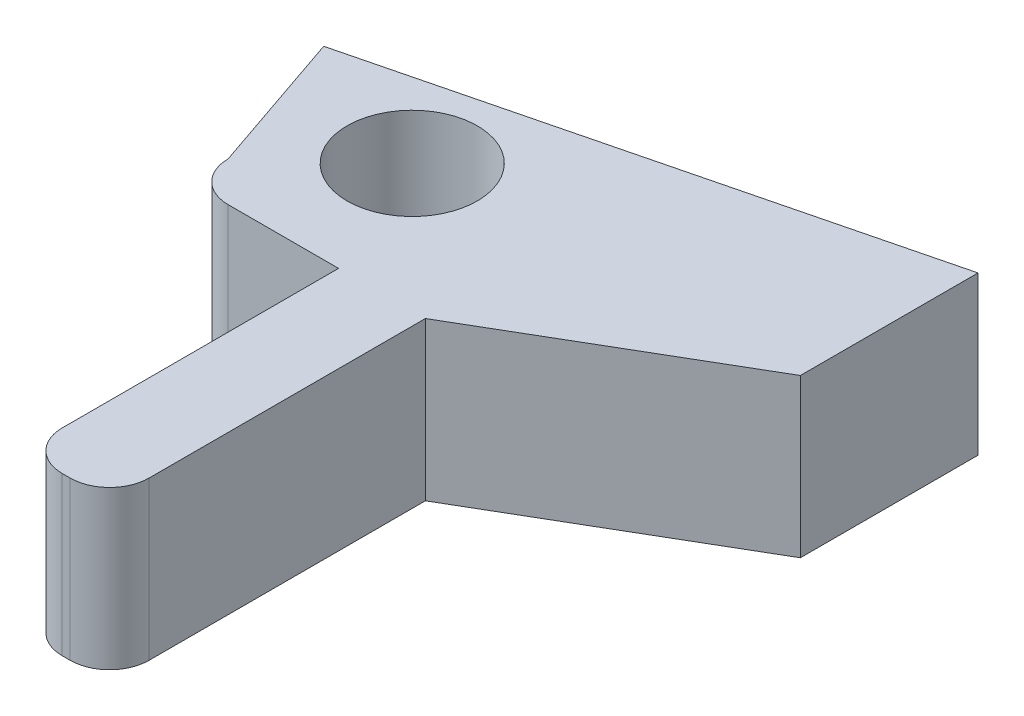
ISO-10303-21;
HEADER;
FILE_DESCRIPTION(('STEP AP214'),'2;1');
FILE_NAME('part.step','',(''),(''),'','','');
FILE_SCHEMA(('AUTOMOTIVE_DESIGN { 1 0 10303 214 1 1 1 1 }'));
ENDSEC;
DATA;
#1=APPLICATION_CONTEXT('core data for automotive mechanical design processes');
#2=APPLICATION_PROTOCOL_DEFINITION('international standard','automotive_design',2000,#1);
#3=PRODUCT_CONTEXT('',#1,'mechanical');
#4=PRODUCT('Part','Part','',(#3));
#5=PRODUCT_RELATED_PRODUCT_CATEGORY('part','',(#4));
#6=PRODUCT_DEFINITION_FORMATION('','',#4);
#7=PRODUCT_DEFINITION_CONTEXT('part definition',#1,'design');
#8=PRODUCT_DEFINITION('design','',#6,#7);
#9=PRODUCT_DEFINITION_SHAPE('','',#8);
#10=(LENGTH_UNIT() NAMED_UNIT(*) SI_UNIT(.MILLI.,.METRE.));
#11=(NAMED_UNIT(*) PLANE_ANGLE_UNIT() SI_UNIT($,.RADIAN.));
#12=(NAMED_UNIT(*) SI_UNIT($,.STERADIAN.) SOLID_ANGLE_UNIT());
#13=UNCERTAINTY_MEASURE_WITH_UNIT(LENGTH_MEASURE(1.E-05),#10,'distance_accuracy_value','');
#14=(GEOMETRIC_REPRESENTATION_CONTEXT(3) GLOBAL_UNCERTAINTY_ASSIGNED_CONTEXT((#13)) GLOBAL_UNIT_ASSIGNED_CONTEXT((#10,
#11,#12)) REPRESENTATION_CONTEXT('',''));
#15=CARTESIAN_POINT('',(0.,0.,0.));
#16=DIRECTION('',(0.,0.,1.));
#17=DIRECTION('',(1.,0.,0.));
#18=AXIS2_PLACEMENT_3D('',#15,#16,#17);
#19=CARTESIAN_POINT('',(0.,4.,0.));
#20=DIRECTION('',(0.,1.,0.));
#21=DIRECTION('',(0.,0.,1.));
#22=AXIS2_PLACEMENT_3D('',#19,#20,#21);
#23=PLANE('',#22);
#24=DIRECTION('',(-0.970142500145332,0.,0.242535625036333));
#25=VECTOR('',#24,1.);
#26=CARTESIAN_POINT('',(4.78197201882964,4.,-3.));
#27=LINE('',#26,#25);
#28=CARTESIAN_POINT('',(4.78197201882964,4.,-3.));
#29=VERTEX_POINT('',#28);
#30=CARTESIAN_POINT('',(-8.47921323135929,4.,0.315296312547233));
#31=VERTEX_POINT('',#30);
#32=EDGE_CURVE('E166',#29,#31,#27,.T.);
#33=ORIENTED_EDGE('',*,*,#32,.T.);
#34=DIRECTION('',(0.323832197654848,0.,0.946114532053087));
#35=VECTOR('',#34,1.);
#36=CARTESIAN_POINT('',(-8.47921323135929,4.,0.315296312547233));
#37=LINE('',#36,#35);
#38=CARTESIAN_POINT('',(-7.21802798117036,4.,4.00000000000001));
#39=VERTEX_POINT('',#38);
#40=EDGE_CURVE('E132',#31,#39,#37,.T.);
#41=ORIENTED_EDGE('',*,*,#40,.T.);
#42=CARTESIAN_POINT('',(-6.21802798117036,4.,4.));
#43=DIRECTION('',(0.,1.,0.));
#44=DIRECTION('',(0.,0.,1.));
#45=AXIS2_PLACEMENT_3D('',#42,#43,#44);
#46=CIRCLE('',#45,1.);
#47=CARTESIAN_POINT('',(-6.21802798117036,4.,5.));
#48=VERTEX_POINT('',#47);
#49=EDGE_CURVE('E11',#39,#48,#46,.T.);
#50=ORIENTED_EDGE('',*,*,#49,.T.);
#51=DIRECTION('',(1.,0.,0.));
#52=VECTOR('',#51,1.);
#53=CARTESIAN_POINT('',(-7.21802798117036,4.,5.));
#54=LINE('',#53,#52);
#55=CARTESIAN_POINT('',(-3.41802798117036,4.,5.));
#56=VERTEX_POINT('',#55);
#57=EDGE_CURVE('E169',#48,#56,#54,.T.);
#58=ORIENTED_EDGE('',*,*,#57,.T.);
#59=DIRECTION('',(0.,0.,1.));
#60=VECTOR('',#59,1.);
#61=CARTESIAN_POINT('',(-3.41802798117036,4.,5.));
#62=LINE('',#61,#60);
#63=CARTESIAN_POINT('',(-3.41802798117036,4.,12.));
#64=VERTEX_POINT('',#63);
#65=EDGE_CURVE('E151',#56,#64,#62,.T.);
#66=ORIENTED_EDGE('',*,*,#65,.T.);
#67=CARTESIAN_POINT('',(-2.41802798117036,4.,12.));
#68=DIRECTION('',(0.,1.,0.));
#69=DIRECTION('',(0.,0.,1.));
#70=AXIS2_PLACEMENT_3D('',#67,#68,#69);
#71=CIRCLE('',#70,1.);
#72=CARTESIAN_POINT('',(-2.41802798117036,4.,13.));
#73=VERTEX_POINT('',#72);
#74=EDGE_CURVE('E190',#64,#73,#71,.T.);
#75=ORIENTED_EDGE('',*,*,#74,.T.);
#76=DIRECTION('',(1.,0.,0.));
#77=VECTOR('',#76,1.);
#78=CARTESIAN_POINT('',(-1.21802798117036,4.,13.));
#79=LINE('',#78,#77);
#80=CARTESIAN_POINT('',(-2.21802798117036,4.,13.));
#81=VERTEX_POINT('',#80);
#82=EDGE_CURVE('E143',#73,#81,#79,.T.);
#83=ORIENTED_EDGE('',*,*,#82,.T.);
#84=CARTESIAN_POINT('',(-2.21802798117036,4.,12.));
#85=DIRECTION('',(0.,1.,0.));
#86=DIRECTION('',(0.,0.,1.));
#87=AXIS2_PLACEMENT_3D('',#84,#85,#86);
#88=CIRCLE('',#87,1.);
#89=CARTESIAN_POINT('',(-1.21802798117036,4.,12.));
#90=VERTEX_POINT('',#89);
#91=EDGE_CURVE('E192',#81,#90,#88,.T.);
#92=ORIENTED_EDGE('',*,*,#91,.T.);
#93=DIRECTION('',(0.,0.,-1.));
#94=VECTOR('',#93,1.);
#95=CARTESIAN_POINT('',(-1.21802798117036,4.,5.));
#96=LINE('',#95,#94);
#97=CARTESIAN_POINT('',(-1.21802798117036,4.,5.));
#98=VERTEX_POINT('',#97);
#99=EDGE_CURVE('E133',#90,#98,#96,.T.);
#100=ORIENTED_EDGE('',*,*,#99,.T.);
#101=DIRECTION('',(0.863778900898433,0.,-0.503871025524086));
#102=VECTOR('',#101,1.);
#103=CARTESIAN_POINT('',(-1.21802798117036,4.,5.));
#104=LINE('',#103,#102);
#105=CARTESIAN_POINT('',(4.78197201882964,4.,1.5));
#106=VERTEX_POINT('',#105);
#107=EDGE_CURVE('E171',#98,#106,#104,.T.);
#108=ORIENTED_EDGE('',*,*,#107,.T.);
#109=DIRECTION('',(0.,0.,-1.));
#110=VECTOR('',#109,1.);
#111=CARTESIAN_POINT('',(4.78197201882964,4.,-3.));
#112=LINE('',#111,#110);
#113=EDGE_CURVE('E163',#106,#29,#112,.T.);
#114=ORIENTED_EDGE('',*,*,#113,.T.);
#115=EDGE_LOOP('',(#33,#41,#50,#58,#66,#75,#83,#92,#100,#108,#114));
#116=FACE_BOUND('',#115,.T.);
#117=CARTESIAN_POINT('',(-4.78871413016682,4.,1.76345727197927));
#118=DIRECTION('',(0.,1.,0.));
#119=DIRECTION('',(0.,0.,1.));
#120=AXIS2_PLACEMENT_3D('',#117,#118,#119);
#121=CIRCLE('',#120,1.65);
#122=CARTESIAN_POINT('',(-4.78871413016682,4.,3.41345727197927));
#123=VERTEX_POINT('',#122);
#124=EDGE_CURVE('E125',#123,#123,#121,.T.);
#125=ORIENTED_EDGE('',*,*,#124,.F.);
#126=EDGE_LOOP('',(#125));
#127=FACE_BOUND('',#126,.T.);
#128=ADVANCED_FACE('F33',(#116,#127),#23,.T.);
#129=CARTESIAN_POINT('',(0.,0.,0.));
#130=DIRECTION('',(0.,1.,0.));
#131=DIRECTION('',(0.,0.,1.));
#132=AXIS2_PLACEMENT_3D('',#129,#130,#131);
#133=PLANE('',#132);
#134=DIRECTION('',(1.,0.,0.));
#135=VECTOR('',#134,1.);
#136=CARTESIAN_POINT('',(-7.21802798117036,0.,5.));
#137=LINE('',#136,#135);
#138=CARTESIAN_POINT('',(-6.21802798117036,0.,5.));
#139=VERTEX_POINT('',#138);
#140=CARTESIAN_POINT('',(-3.41802798117036,0.,5.));
#141=VERTEX_POINT('',#140);
#142=EDGE_CURVE('E124',#139,#141,#137,.T.);
#143=ORIENTED_EDGE('',*,*,#142,.F.);
#144=CARTESIAN_POINT('',(-6.21802798117036,0.,4.));
#145=DIRECTION('',(0.,1.,0.));
#146=DIRECTION('',(0.,0.,1.));
#147=AXIS2_PLACEMENT_3D('',#144,#145,#146);
#148=CIRCLE('',#147,1.);
#149=CARTESIAN_POINT('',(-7.21802798117036,0.,4.));
#150=VERTEX_POINT('',#149);
#151=EDGE_CURVE('E48',#139,#150,#148,.F.);
#152=ORIENTED_EDGE('',*,*,#151,.T.);
#153=DIRECTION('',(0.323832197654848,0.,0.946114532053087));
#154=VECTOR('',#153,1.);
#155=CARTESIAN_POINT('',(-8.47921323135929,0.,0.315296312547233));
#156=LINE('',#155,#154);
#157=CARTESIAN_POINT('',(-8.47921323135929,0.,0.315296312547233));
#158=VERTEX_POINT('',#157);
#159=EDGE_CURVE('E131',#158,#150,#156,.T.);
#160=ORIENTED_EDGE('',*,*,#159,.F.);
#161=DIRECTION('',(-0.970142500145332,0.,0.242535625036333));
#162=VECTOR('',#161,1.);
#163=CARTESIAN_POINT('',(4.78197201882964,0.,-3.));
#164=LINE('',#163,#162);
#165=CARTESIAN_POINT('',(4.78197201882964,0.,-3.));
#166=VERTEX_POINT('',#165);
#167=EDGE_CURVE('E116',#166,#158,#164,.T.);
#168=ORIENTED_EDGE('',*,*,#167,.F.);
#169=DIRECTION('',(0.,0.,-1.));
#170=VECTOR('',#169,1.);
#171=CARTESIAN_POINT('',(4.78197201882964,0.,0.));
#172=LINE('',#171,#170);
#173=CARTESIAN_POINT('',(4.78197201882964,0.,1.5));
#174=VERTEX_POINT('',#173);
#175=EDGE_CURVE('E167',#174,#166,#172,.T.);
#176=ORIENTED_EDGE('',*,*,#175,.F.);
#177=DIRECTION('',(0.863778900898433,0.,-0.503871025524086));
#178=VECTOR('',#177,1.);
#179=CARTESIAN_POINT('',(-1.21802798117036,0.,5.));
#180=LINE('',#179,#178);
#181=CARTESIAN_POINT('',(-1.21802798117036,0.,5.));
#182=VERTEX_POINT('',#181);
#183=EDGE_CURVE('E176',#182,#174,#180,.T.);
#184=ORIENTED_EDGE('',*,*,#183,.F.);
#185=DIRECTION('',(0.,0.,-1.));
#186=VECTOR('',#185,1.);
#187=CARTESIAN_POINT('',(-1.21802798117036,0.,5.));
#188=LINE('',#187,#186);
#189=CARTESIAN_POINT('',(-1.21802798117036,0.,12.));
#190=VERTEX_POINT('',#189);
#191=EDGE_CURVE('E140',#190,#182,#188,.T.);
#192=ORIENTED_EDGE('',*,*,#191,.F.);
#193=CARTESIAN_POINT('',(-2.21802798117036,0.,12.));
#194=DIRECTION('',(0.,1.,0.));
#195=DIRECTION('',(0.,0.,1.));
#196=AXIS2_PLACEMENT_3D('',#193,#194,#195);
#197=CIRCLE('',#196,1.);
#198=CARTESIAN_POINT('',(-2.21802798117036,0.,13.));
#199=VERTEX_POINT('',#198);
#200=EDGE_CURVE('E198',#190,#199,#197,.F.);
#201=ORIENTED_EDGE('',*,*,#200,.T.);
#202=DIRECTION('',(1.,0.,0.));
#203=VECTOR('',#202,1.);
#204=CARTESIAN_POINT('',(-1.21802798117036,0.,13.));
#205=LINE('',#204,#203);
#206=CARTESIAN_POINT('',(-2.41802798117036,0.,13.));
#207=VERTEX_POINT('',#206);
#208=EDGE_CURVE('E146',#207,#199,#205,.T.);
#209=ORIENTED_EDGE('',*,*,#208,.F.);
#210=CARTESIAN_POINT('',(-2.41802798117036,0.,12.));
#211=DIRECTION('',(0.,1.,0.));
#212=DIRECTION('',(0.,0.,1.));
#213=AXIS2_PLACEMENT_3D('',#210,#211,#212);
#214=CIRCLE('',#213,1.);
#215=CARTESIAN_POINT('',(-3.41802798117036,0.,12.));
#216=VERTEX_POINT('',#215);
#217=EDGE_CURVE('E196',#207,#216,#214,.F.);
#218=ORIENTED_EDGE('',*,*,#217,.T.);
#219=DIRECTION('',(0.,0.,1.));
#220=VECTOR('',#219,1.);
#221=CARTESIAN_POINT('',(-3.41802798117036,0.,5.));
#222=LINE('',#221,#220);
#223=EDGE_CURVE('E142',#141,#216,#222,.T.);
#224=ORIENTED_EDGE('',*,*,#223,.F.);
#225=EDGE_LOOP('',(#143,#152,#160,#168,#176,#184,#192,#201,#209,#218,#224));
#226=FACE_BOUND('',#225,.T.);
#227=CARTESIAN_POINT('',(-4.78871413016682,0.,1.76345727197927));
#228=DIRECTION('',(0.,1.,0.));
#229=DIRECTION('',(0.,0.,1.));
#230=AXIS2_PLACEMENT_3D('',#227,#228,#229);
#231=CIRCLE('',#230,1.65);
#232=CARTESIAN_POINT('',(-4.78871413016682,0.,3.41345727197927));
#233=VERTEX_POINT('',#232);
#234=EDGE_CURVE('E158',#233,#233,#231,.T.);
#235=ORIENTED_EDGE('',*,*,#234,.T.);
#236=EDGE_LOOP('',(#235));
#237=FACE_BOUND('',#236,.T.);
#238=ADVANCED_FACE('F135',(#226,#237),#133,.F.);
#239=CARTESIAN_POINT('',(4.78197201882964,4.,-3.));
#240=DIRECTION('',(0.242535625036333,0.,0.970142500145332));
#241=DIRECTION('',(0.970142500145332,0.,-0.242535625036333));
#242=AXIS2_PLACEMENT_3D('',#239,#240,#241);
#243=PLANE('',#242);
#244=ORIENTED_EDGE('',*,*,#167,.T.);
#245=DIRECTION('',(0.,1.,0.));
#246=VECTOR('',#245,1.);
#247=CARTESIAN_POINT('',(-8.47921323135929,0.,0.315296312547233));
#248=LINE('',#247,#246);
#249=EDGE_CURVE('E119',#158,#31,#248,.T.);
#250=ORIENTED_EDGE('',*,*,#249,.T.);
#251=ORIENTED_EDGE('',*,*,#32,.F.);
#252=DIRECTION('',(0.,-1.,0.));
#253=VECTOR('',#252,1.);
#254=CARTESIAN_POINT('',(4.78197201882964,4.,-3.));
#255=LINE('',#254,#253);
#256=EDGE_CURVE('E122',#29,#166,#255,.T.);
#257=ORIENTED_EDGE('',*,*,#256,.T.);
#258=EDGE_LOOP('',(#244,#250,#251,#257));
#259=FACE_BOUND('',#258,.T.);
#260=ADVANCED_FACE('F118',(#259),#243,.F.);
#261=CARTESIAN_POINT('',(-7.21802798117036,4.,5.));
#262=DIRECTION('',(0.,0.,-1.));
#263=DIRECTION('',(-1.,0.,0.));
#264=AXIS2_PLACEMENT_3D('',#261,#262,#263);
#265=PLANE('',#264);
#266=ORIENTED_EDGE('',*,*,#57,.F.);
#267=DIRECTION('',(0.,-1.,0.));
#268=VECTOR('',#267,1.);
#269=CARTESIAN_POINT('',(-6.21802798117036,4.,5.));
#270=LINE('',#269,#268);
#271=EDGE_CURVE('E203',#48,#139,#270,.T.);
#272=ORIENTED_EDGE('',*,*,#271,.T.);
#273=ORIENTED_EDGE('',*,*,#142,.T.);
#274=DIRECTION('',(0.,1.,0.));
#275=VECTOR('',#274,1.);
#276=CARTESIAN_POINT('',(-3.41802798117036,0.,5.));
#277=LINE('',#276,#275);
#278=EDGE_CURVE('E149',#141,#56,#277,.T.);
#279=ORIENTED_EDGE('',*,*,#278,.T.);
#280=EDGE_LOOP('',(#266,#272,#273,#279));
#281=FACE_BOUND('',#280,.T.);
#282=ADVANCED_FACE('F240',(#281),#265,.F.);
#283=CARTESIAN_POINT('',(-1.21802798117036,4.,5.));
#284=DIRECTION('',(-0.503871025524086,0.,-0.863778900898433));
#285=DIRECTION('',(-0.863778900898433,0.,0.503871025524086));
#286=AXIS2_PLACEMENT_3D('',#283,#284,#285);
#287=PLANE('',#286);
#288=ORIENTED_EDGE('',*,*,#183,.T.);
#289=DIRECTION('',(0.,-1.,0.));
#290=VECTOR('',#289,1.);
#291=CARTESIAN_POINT('',(4.78197201882964,4.,1.5));
#292=LINE('',#291,#290);
#293=EDGE_CURVE('E173',#106,#174,#292,.T.);
#294=ORIENTED_EDGE('',*,*,#293,.F.);
#295=ORIENTED_EDGE('',*,*,#107,.F.);
#296=DIRECTION('',(0.,-1.,0.));
#297=VECTOR('',#296,1.);
#298=CARTESIAN_POINT('',(-1.21802798117036,4.,5.));
#299=LINE('',#298,#297);
#300=EDGE_CURVE('E181',#98,#182,#299,.T.);
#301=ORIENTED_EDGE('',*,*,#300,.T.);
#302=EDGE_LOOP('',(#288,#294,#295,#301));
#303=FACE_BOUND('',#302,.T.);
#304=ADVANCED_FACE('F216',(#303),#287,.F.);
#305=CARTESIAN_POINT('',(4.78197201882964,4.,0.));
#306=DIRECTION('',(-1.,0.,0.));
#307=DIRECTION('',(0.,0.,1.));
#308=AXIS2_PLACEMENT_3D('',#305,#306,#307);
#309=PLANE('',#308);
#310=ORIENTED_EDGE('',*,*,#175,.T.);
#311=ORIENTED_EDGE('',*,*,#256,.F.);
#312=ORIENTED_EDGE('',*,*,#113,.F.);
#313=ORIENTED_EDGE('',*,*,#293,.T.);
#314=EDGE_LOOP('',(#310,#311,#312,#313));
#315=FACE_BOUND('',#314,.T.);
#316=ADVANCED_FACE('F211',(#315),#309,.F.);
#317=CARTESIAN_POINT('',(-4.78871413016682,4.,1.76345727197927));
#318=DIRECTION('',(0.,-1.,0.));
#319=DIRECTION('',(0.,0.,-1.));
#320=AXIS2_PLACEMENT_3D('',#317,#318,#319);
#321=CYLINDRICAL_SURFACE('',#320,1.65);
#322=ORIENTED_EDGE('',*,*,#124,.T.);
#323=EDGE_LOOP('',(#322));
#324=FACE_BOUND('',#323,.T.);
#325=ORIENTED_EDGE('',*,*,#234,.F.);
#326=EDGE_LOOP('',(#325));
#327=FACE_BOUND('',#326,.T.);
#328=ADVANCED_FACE('F257',(#324,#327),#321,.F.);
#329=CARTESIAN_POINT('',(-1.21802798117036,0.,5.));
#330=DIRECTION('',(1.,0.,0.));
#331=DIRECTION('',(0.,0.,-1.));
#332=AXIS2_PLACEMENT_3D('',#329,#330,#331);
#333=PLANE('',#332);
#334=ORIENTED_EDGE('',*,*,#99,.F.);
#335=DIRECTION('',(0.,1.,0.));
#336=VECTOR('',#335,1.);
#337=CARTESIAN_POINT('',(-1.21802798117036,0.,12.));
#338=LINE('',#337,#336);
#339=EDGE_CURVE('E194',#90,#190,#338,.F.);
#340=ORIENTED_EDGE('',*,*,#339,.T.);
#341=ORIENTED_EDGE('',*,*,#191,.T.);
#342=ORIENTED_EDGE('',*,*,#300,.F.);
#343=EDGE_LOOP('',(#334,#340,#341,#342));
#344=FACE_BOUND('',#343,.T.);
#345=ADVANCED_FACE('F220',(#344),#333,.T.);
#346=CARTESIAN_POINT('',(-1.21802798117036,0.,13.));
#347=DIRECTION('',(0.,0.,1.));
#348=DIRECTION('',(1.,0.,0.));
#349=AXIS2_PLACEMENT_3D('',#346,#347,#348);
#350=PLANE('',#349);
#351=ORIENTED_EDGE('',*,*,#208,.T.);
#352=DIRECTION('',(0.,1.,0.));
#353=VECTOR('',#352,1.);
#354=CARTESIAN_POINT('',(-2.21802798117036,0.,13.));
#355=LINE('',#354,#353);
#356=EDGE_CURVE('E187',#199,#81,#355,.T.);
#357=ORIENTED_EDGE('',*,*,#356,.T.);
#358=ORIENTED_EDGE('',*,*,#82,.F.);
#359=DIRECTION('',(0.,1.,0.));
#360=VECTOR('',#359,1.);
#361=CARTESIAN_POINT('',(-2.41802798117036,0.,13.));
#362=LINE('',#361,#360);
#363=EDGE_CURVE('E185',#73,#207,#362,.F.);
#364=ORIENTED_EDGE('',*,*,#363,.T.);
#365=EDGE_LOOP('',(#351,#357,#358,#364));
#366=FACE_BOUND('',#365,.T.);
#367=ADVANCED_FACE('F228',(#366),#350,.T.);
#368=CARTESIAN_POINT('',(-3.41802798117036,0.,5.));
#369=DIRECTION('',(-1.,0.,0.));
#370=DIRECTION('',(0.,0.,1.));
#371=AXIS2_PLACEMENT_3D('',#368,#369,#370);
#372=PLANE('',#371);
#373=ORIENTED_EDGE('',*,*,#223,.T.);
#374=DIRECTION('',(0.,1.,0.));
#375=VECTOR('',#374,1.);
#376=CARTESIAN_POINT('',(-3.41802798117036,0.,12.));
#377=LINE('',#376,#375);
#378=EDGE_CURVE('E200',#216,#64,#377,.T.);
#379=ORIENTED_EDGE('',*,*,#378,.T.);
#380=ORIENTED_EDGE('',*,*,#65,.F.);
#381=ORIENTED_EDGE('',*,*,#278,.F.);
#382=EDGE_LOOP('',(#373,#379,#380,#381));
#383=FACE_BOUND('',#382,.T.);
#384=ADVANCED_FACE('F237',(#383),#372,.T.);
#385=CARTESIAN_POINT('',(-2.21802798117036,0.,12.));
#386=DIRECTION('',(0.,1.,0.));
#387=DIRECTION('',(0.,0.,1.));
#388=AXIS2_PLACEMENT_3D('',#385,#386,#387);
#389=CYLINDRICAL_SURFACE('',#388,1.);
#390=ORIENTED_EDGE('',*,*,#200,.F.);
#391=ORIENTED_EDGE('',*,*,#339,.F.);
#392=ORIENTED_EDGE('',*,*,#91,.F.);
#393=ORIENTED_EDGE('',*,*,#356,.F.);
#394=EDGE_LOOP('',(#390,#391,#392,#393));
#395=FACE_BOUND('',#394,.T.);
#396=ADVANCED_FACE('F223',(#395),#389,.T.);
#397=CARTESIAN_POINT('',(-2.41802798117036,0.,12.));
#398=DIRECTION('',(0.,1.,0.));
#399=DIRECTION('',(0.,0.,1.));
#400=AXIS2_PLACEMENT_3D('',#397,#398,#399);
#401=CYLINDRICAL_SURFACE('',#400,1.);
#402=ORIENTED_EDGE('',*,*,#217,.F.);
#403=ORIENTED_EDGE('',*,*,#363,.F.);
#404=ORIENTED_EDGE('',*,*,#74,.F.);
#405=ORIENTED_EDGE('',*,*,#378,.F.);
#406=EDGE_LOOP('',(#402,#403,#404,#405));
#407=FACE_BOUND('',#406,.T.);
#408=ADVANCED_FACE('F232',(#407),#401,.T.);
#409=CARTESIAN_POINT('',(-6.21802798117036,4.,4.));
#410=DIRECTION('',(0.,-1.,0.));
#411=DIRECTION('',(0.,0.,-1.));
#412=AXIS2_PLACEMENT_3D('',#409,#410,#411);
#413=CYLINDRICAL_SURFACE('',#412,1.);
#414=ORIENTED_EDGE('',*,*,#49,.F.);
#415=DIRECTION('',(0.,-1.,0.));
#416=VECTOR('',#415,1.);
#417=CARTESIAN_POINT('',(-7.21802798117036,4.,4.));
#418=LINE('',#417,#416);
#419=EDGE_CURVE('E41',#150,#39,#418,.F.);
#420=ORIENTED_EDGE('',*,*,#419,.F.);
#421=ORIENTED_EDGE('',*,*,#151,.F.);
#422=ORIENTED_EDGE('',*,*,#271,.F.);
#423=EDGE_LOOP('',(#414,#420,#421,#422));
#424=FACE_BOUND('',#423,.T.);
#425=ADVANCED_FACE('F35',(#424),#413,.T.);
#426=CARTESIAN_POINT('',(-8.47921323135929,0.,0.315296312547233));
#427=DIRECTION('',(-0.946114532053087,0.,0.323832197654848));
#428=DIRECTION('',(0.323832197654848,0.,0.946114532053087));
#429=AXIS2_PLACEMENT_3D('',#426,#427,#428);
#430=PLANE('',#429);
#431=ORIENTED_EDGE('',*,*,#40,.F.);
#432=ORIENTED_EDGE('',*,*,#249,.F.);
#433=ORIENTED_EDGE('',*,*,#159,.T.);
#434=ORIENTED_EDGE('',*,*,#419,.T.);
#435=EDGE_LOOP('',(#431,#432,#433,#434));
#436=FACE_BOUND('',#435,.T.);
#437=ADVANCED_FACE('F129',(#436),#430,.T.);
#438=CLOSED_SHELL('',(#128,#238,#260,#282,#304,#316,#328,#345,#367,#384,#396,#408,#425,#437));
#439=MANIFOLD_SOLID_BREP('B2',#438);
#440=ADVANCED_BREP_SHAPE_REPRESENTATION('',(#18,#439),#14);
#441=SHAPE_DEFINITION_REPRESENTATION(#9,#440);
ENDSEC;
END-ISO-10303-21;
